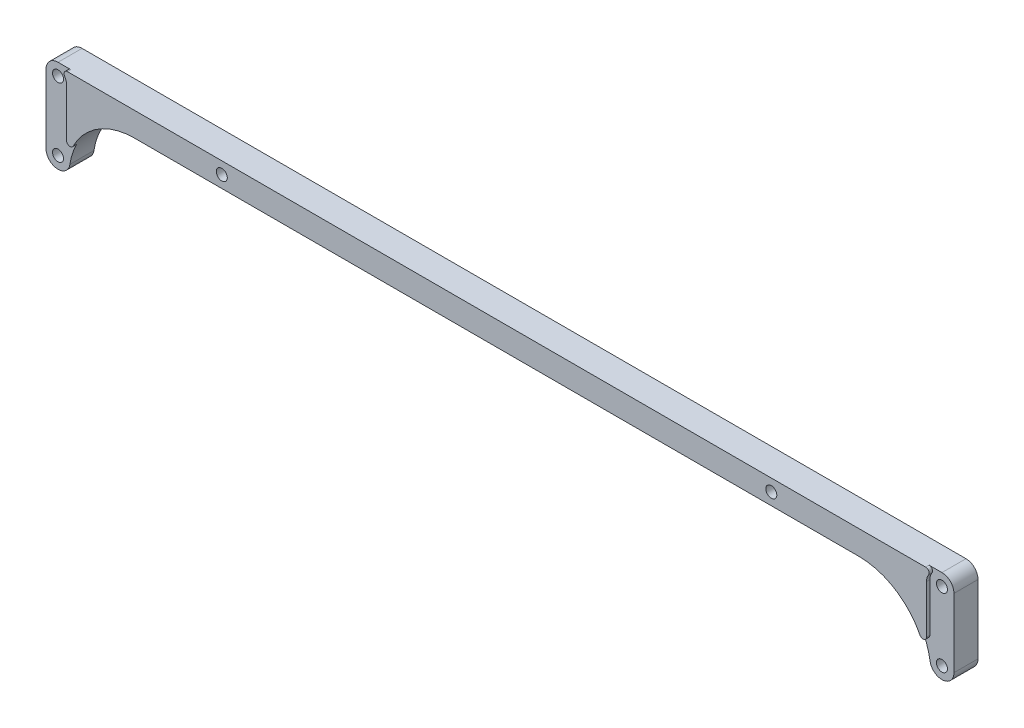
ISO-10303-21;
HEADER;
FILE_DESCRIPTION(('STEP AP214'),'2;1');
FILE_NAME('part.step','',(''),(''),'','','');
FILE_SCHEMA(('AUTOMOTIVE_DESIGN { 1 0 10303 214 1 1 1 1 }'));
ENDSEC;
DATA;
#1=APPLICATION_CONTEXT('core data for automotive mechanical design processes');
#2=APPLICATION_PROTOCOL_DEFINITION('international standard','automotive_design',2000,#1);
#3=PRODUCT_CONTEXT('',#1,'mechanical');
#4=PRODUCT('Part','Part','',(#3));
#5=PRODUCT_RELATED_PRODUCT_CATEGORY('part','',(#4));
#6=PRODUCT_DEFINITION_FORMATION('','',#4);
#7=PRODUCT_DEFINITION_CONTEXT('part definition',#1,'design');
#8=PRODUCT_DEFINITION('design','',#6,#7);
#9=PRODUCT_DEFINITION_SHAPE('','',#8);
#10=(LENGTH_UNIT() NAMED_UNIT(*) SI_UNIT(.MILLI.,.METRE.));
#11=(NAMED_UNIT(*) PLANE_ANGLE_UNIT() SI_UNIT($,.RADIAN.));
#12=(NAMED_UNIT(*) SI_UNIT($,.STERADIAN.) SOLID_ANGLE_UNIT());
#13=UNCERTAINTY_MEASURE_WITH_UNIT(LENGTH_MEASURE(1.E-05),#10,'distance_accuracy_value','');
#14=(GEOMETRIC_REPRESENTATION_CONTEXT(3) GLOBAL_UNCERTAINTY_ASSIGNED_CONTEXT((#13)) GLOBAL_UNIT_ASSIGNED_CONTEXT((#10,
#11,#12)) REPRESENTATION_CONTEXT('',''));
#15=CARTESIAN_POINT('',(0.,0.,0.));
#16=DIRECTION('',(0.,0.,1.));
#17=DIRECTION('',(1.,0.,0.));
#18=AXIS2_PLACEMENT_3D('',#15,#16,#17);
#19=CARTESIAN_POINT('',(-128.683849371952,-20.,-8.));
#20=DIRECTION('',(0.,0.,1.));
#21=DIRECTION('',(1.,0.,0.));
#22=AXIS2_PLACEMENT_3D('',#19,#20,#21);
#23=PLANE('',#22);
#24=CARTESIAN_POINT('',(-128.683849371952,-20.,-8.));
#25=DIRECTION('',(0.,0.,-1.));
#26=DIRECTION('',(-1.,0.,0.));
#27=AXIS2_PLACEMENT_3D('',#24,#25,#26);
#28=CIRCLE('',#27,1.59999999999999);
#29=CARTESIAN_POINT('',(-130.283849371952,-20.,-8.));
#30=VERTEX_POINT('',#29);
#31=EDGE_CURVE('E479',#30,#30,#28,.T.);
#32=ORIENTED_EDGE('',*,*,#31,.F.);
#33=EDGE_LOOP('',(#32));
#34=FACE_BOUND('',#33,.T.);
#35=CARTESIAN_POINT('',(-128.683849371952,0.,-8.));
#36=DIRECTION('',(0.,0.,-1.));
#37=DIRECTION('',(-1.,0.,0.));
#38=AXIS2_PLACEMENT_3D('',#35,#36,#37);
#39=CIRCLE('',#38,1.59999999999999);
#40=CARTESIAN_POINT('',(-130.283849371952,0.,-8.));
#41=VERTEX_POINT('',#40);
#42=EDGE_CURVE('E481',#41,#41,#39,.T.);
#43=ORIENTED_EDGE('',*,*,#42,.F.);
#44=EDGE_LOOP('',(#43));
#45=FACE_BOUND('',#44,.T.);
#46=CARTESIAN_POINT('',(-80.,0.,-8.));
#47=DIRECTION('',(0.,0.,-1.));
#48=DIRECTION('',(-1.,0.,0.));
#49=AXIS2_PLACEMENT_3D('',#46,#47,#48);
#50=CIRCLE('',#49,1.59999999999999);
#51=CARTESIAN_POINT('',(-81.6,0.,-8.));
#52=VERTEX_POINT('',#51);
#53=EDGE_CURVE('E489',#52,#52,#50,.T.);
#54=ORIENTED_EDGE('',*,*,#53,.F.);
#55=EDGE_LOOP('',(#54));
#56=FACE_BOUND('',#55,.T.);
#57=CARTESIAN_POINT('',(128.683849371952,-20.,-8.));
#58=DIRECTION('',(0.,0.,-1.));
#59=DIRECTION('',(-1.,0.,0.));
#60=AXIS2_PLACEMENT_3D('',#57,#58,#59);
#61=CIRCLE('',#60,1.59999999999999);
#62=CARTESIAN_POINT('',(127.083849371952,-20.,-8.));
#63=VERTEX_POINT('',#62);
#64=EDGE_CURVE('E495',#63,#63,#61,.T.);
#65=ORIENTED_EDGE('',*,*,#64,.F.);
#66=EDGE_LOOP('',(#65));
#67=FACE_BOUND('',#66,.T.);
#68=CARTESIAN_POINT('',(128.683849371952,0.,-8.));
#69=DIRECTION('',(0.,0.,-1.));
#70=DIRECTION('',(-1.,0.,0.));
#71=AXIS2_PLACEMENT_3D('',#68,#69,#70);
#72=CIRCLE('',#71,1.59999999999999);
#73=CARTESIAN_POINT('',(127.083849371952,0.,-8.));
#74=VERTEX_POINT('',#73);
#75=EDGE_CURVE('E501',#74,#74,#72,.T.);
#76=ORIENTED_EDGE('',*,*,#75,.F.);
#77=EDGE_LOOP('',(#76));
#78=FACE_BOUND('',#77,.T.);
#79=DIRECTION('',(0.,-1.,0.));
#80=VECTOR('',#79,1.);
#81=CARTESIAN_POINT('',(-132.183849371952,0.,-8.));
#82=LINE('',#81,#80);
#83=CARTESIAN_POINT('',(-132.183849371952,0.,-8.));
#84=VERTEX_POINT('',#83);
#85=CARTESIAN_POINT('',(-132.183849371952,-20.,-8.));
#86=VERTEX_POINT('',#85);
#87=EDGE_CURVE('E234',#84,#86,#82,.T.);
#88=ORIENTED_EDGE('',*,*,#87,.F.);
#89=CARTESIAN_POINT('',(-128.683849371952,0.,-8.));
#90=DIRECTION('',(0.,0.,1.));
#91=DIRECTION('',(1.,0.,0.));
#92=AXIS2_PLACEMENT_3D('',#89,#90,#91);
#93=CIRCLE('',#92,3.5);
#94=CARTESIAN_POINT('',(-128.683849371952,3.49999999999997,-8.));
#95=VERTEX_POINT('',#94);
#96=EDGE_CURVE('E257',#95,#84,#93,.T.);
#97=ORIENTED_EDGE('',*,*,#96,.F.);
#98=DIRECTION('',(1.,0.,0.));
#99=VECTOR('',#98,1.);
#100=CARTESIAN_POINT('',(-128.683849371952,3.49999999999997,-8.));
#101=LINE('',#100,#99);
#102=CARTESIAN_POINT('',(128.683849371952,3.50000000000001,-8.));
#103=VERTEX_POINT('',#102);
#104=EDGE_CURVE('E255',#95,#103,#101,.T.);
#105=ORIENTED_EDGE('',*,*,#104,.T.);
#106=CARTESIAN_POINT('',(128.683849371952,0.,-8.));
#107=DIRECTION('',(0.,0.,-1.));
#108=DIRECTION('',(-1.,0.,0.));
#109=AXIS2_PLACEMENT_3D('',#106,#107,#108);
#110=CIRCLE('',#109,3.5);
#111=CARTESIAN_POINT('',(132.183849371952,0.,-8.));
#112=VERTEX_POINT('',#111);
#113=EDGE_CURVE('E253',#103,#112,#110,.T.);
#114=ORIENTED_EDGE('',*,*,#113,.T.);
#115=DIRECTION('',(0.,-1.,0.));
#116=VECTOR('',#115,1.);
#117=CARTESIAN_POINT('',(132.183849371952,0.,-8.));
#118=LINE('',#117,#116);
#119=CARTESIAN_POINT('',(132.183849371952,-20.,-8.));
#120=VERTEX_POINT('',#119);
#121=EDGE_CURVE('E251',#112,#120,#118,.T.);
#122=ORIENTED_EDGE('',*,*,#121,.T.);
#123=CARTESIAN_POINT('',(128.683849371952,-20.,-8.));
#124=DIRECTION('',(0.,0.,-1.));
#125=DIRECTION('',(-1.,0.,0.));
#126=AXIS2_PLACEMENT_3D('',#123,#124,#125);
#127=CIRCLE('',#126,3.50000000000001);
#128=CARTESIAN_POINT('',(125.22288553066,-20.5212765957447,-8.));
#129=VERTEX_POINT('',#128);
#130=EDGE_CURVE('E249',#120,#129,#127,.T.);
#131=ORIENTED_EDGE('',*,*,#130,.T.);
#132=CARTESIAN_POINT('',(105.445949294707,-23.5,-8.));
#133=DIRECTION('',(0.,0.,-1.));
#134=DIRECTION('',(-1.,0.,0.));
#135=AXIS2_PLACEMENT_3D('',#132,#133,#134);
#136=CIRCLE('',#135,20.);
#137=CARTESIAN_POINT('',(105.445949294707,-3.50000000000002,-8.));
#138=VERTEX_POINT('',#137);
#139=EDGE_CURVE('E246',#138,#129,#136,.T.);
#140=ORIENTED_EDGE('',*,*,#139,.F.);
#141=DIRECTION('',(1.,0.,0.));
#142=VECTOR('',#141,1.);
#143=CARTESIAN_POINT('',(-105.445949294707,-3.50000000000004,-8.));
#144=LINE('',#143,#142);
#145=CARTESIAN_POINT('',(-105.445949294707,-3.50000000000005,-8.));
#146=VERTEX_POINT('',#145);
#147=EDGE_CURVE('E243',#146,#138,#144,.T.);
#148=ORIENTED_EDGE('',*,*,#147,.F.);
#149=CARTESIAN_POINT('',(-105.445949294707,-23.5,-8.));
#150=DIRECTION('',(0.,0.,1.));
#151=DIRECTION('',(1.,0.,0.));
#152=AXIS2_PLACEMENT_3D('',#149,#150,#151);
#153=CIRCLE('',#152,20.);
#154=CARTESIAN_POINT('',(-125.22288553066,-20.5212765957447,-8.));
#155=VERTEX_POINT('',#154);
#156=EDGE_CURVE('E241',#146,#155,#153,.T.);
#157=ORIENTED_EDGE('',*,*,#156,.T.);
#158=CARTESIAN_POINT('',(-128.683849371952,-20.,-8.));
#159=DIRECTION('',(0.,0.,1.));
#160=DIRECTION('',(1.,0.,0.));
#161=AXIS2_PLACEMENT_3D('',#158,#159,#160);
#162=CIRCLE('',#161,3.50000000000001);
#163=EDGE_CURVE('E237',#86,#155,#162,.T.);
#164=ORIENTED_EDGE('',*,*,#163,.F.);
#165=EDGE_LOOP('',(#88,#97,#105,#114,#122,#131,#140,#148,#157,#164));
#166=FACE_BOUND('',#165,.T.);
#167=CARTESIAN_POINT('',(80.,0.,-8.));
#168=DIRECTION('',(0.,0.,-1.));
#169=DIRECTION('',(-1.,0.,0.));
#170=AXIS2_PLACEMENT_3D('',#167,#168,#169);
#171=CIRCLE('',#170,1.59999999999999);
#172=CARTESIAN_POINT('',(78.4,0.,-8.));
#173=VERTEX_POINT('',#172);
#174=EDGE_CURVE('E506',#173,#173,#171,.T.);
#175=ORIENTED_EDGE('',*,*,#174,.F.);
#176=EDGE_LOOP('',(#175));
#177=FACE_BOUND('',#176,.T.);
#178=ADVANCED_FACE('F34',(#34,#45,#56,#67,#78,#166,#177),#23,.F.);
#179=CARTESIAN_POINT('',(128.683849371952,0.,-8.));
#180=DIRECTION('',(0.,0.,1.));
#181=DIRECTION('',(1.,0.,0.));
#182=AXIS2_PLACEMENT_3D('',#179,#180,#181);
#183=CYLINDRICAL_SURFACE('',#182,3.5);
#184=CARTESIAN_POINT('',(128.683849371952,0.,-1.));
#185=DIRECTION('',(0.,0.,1.));
#186=DIRECTION('',(1.,0.,0.));
#187=AXIS2_PLACEMENT_3D('',#184,#185,#186);
#188=CIRCLE('',#187,3.49999999999998);
#189=CARTESIAN_POINT('',(128.683849371952,3.5,-1.));
#190=VERTEX_POINT('',#189);
#191=CARTESIAN_POINT('',(132.183849371952,0.,-1.));
#192=VERTEX_POINT('',#191);
#193=EDGE_CURVE('E199',#190,#192,#188,.F.);
#194=ORIENTED_EDGE('',*,*,#193,.T.);
#195=DIRECTION('',(0.,0.,1.));
#196=VECTOR('',#195,1.);
#197=CARTESIAN_POINT('',(132.183849371952,0.,-8.));
#198=LINE('',#197,#196);
#199=EDGE_CURVE('E280',#112,#192,#198,.T.);
#200=ORIENTED_EDGE('',*,*,#199,.F.);
#201=ORIENTED_EDGE('',*,*,#113,.F.);
#202=DIRECTION('',(0.,0.,1.));
#203=VECTOR('',#202,1.);
#204=CARTESIAN_POINT('',(128.683849371952,3.50000000000001,-8.));
#205=LINE('',#204,#203);
#206=EDGE_CURVE('E277',#103,#190,#205,.T.);
#207=ORIENTED_EDGE('',*,*,#206,.T.);
#208=EDGE_LOOP('',(#194,#200,#201,#207));
#209=FACE_BOUND('',#208,.T.);
#210=ADVANCED_FACE('F374',(#209),#183,.T.);
#211=CARTESIAN_POINT('',(132.183849371952,0.,-8.));
#212=DIRECTION('',(-1.,0.,0.));
#213=DIRECTION('',(0.,-1.,0.));
#214=AXIS2_PLACEMENT_3D('',#211,#212,#213);
#215=PLANE('',#214);
#216=DIRECTION('',(0.,-1.,0.));
#217=VECTOR('',#216,1.);
#218=CARTESIAN_POINT('',(132.183849371952,1.83441941320406E-13,-1.));
#219=LINE('',#218,#217);
#220=CARTESIAN_POINT('',(132.183849371952,-20.,-1.));
#221=VERTEX_POINT('',#220);
#222=EDGE_CURVE('E194',#192,#221,#219,.T.);
#223=ORIENTED_EDGE('',*,*,#222,.T.);
#224=DIRECTION('',(0.,0.,1.));
#225=VECTOR('',#224,1.);
#226=CARTESIAN_POINT('',(132.183849371952,-20.,-8.));
#227=LINE('',#226,#225);
#228=EDGE_CURVE('E283',#120,#221,#227,.T.);
#229=ORIENTED_EDGE('',*,*,#228,.F.);
#230=ORIENTED_EDGE('',*,*,#121,.F.);
#231=ORIENTED_EDGE('',*,*,#199,.T.);
#232=EDGE_LOOP('',(#223,#229,#230,#231));
#233=FACE_BOUND('',#232,.T.);
#234=ADVANCED_FACE('F371',(#233),#215,.F.);
#235=CARTESIAN_POINT('',(128.683849371952,-20.,-8.));
#236=DIRECTION('',(0.,0.,1.));
#237=DIRECTION('',(1.,0.,0.));
#238=AXIS2_PLACEMENT_3D('',#235,#236,#237);
#239=CYLINDRICAL_SURFACE('',#238,3.50000000000001);
#240=CARTESIAN_POINT('',(128.683849371952,-20.,-1.));
#241=DIRECTION('',(0.,0.,1.));
#242=DIRECTION('',(1.,0.,0.));
#243=AXIS2_PLACEMENT_3D('',#240,#241,#242);
#244=CIRCLE('',#243,3.50000000000001);
#245=CARTESIAN_POINT('',(125.22288553066,-20.5212765957447,-1.));
#246=VERTEX_POINT('',#245);
#247=EDGE_CURVE('E208',#221,#246,#244,.F.);
#248=ORIENTED_EDGE('',*,*,#247,.T.);
#249=DIRECTION('',(0.,0.,1.));
#250=VECTOR('',#249,1.);
#251=CARTESIAN_POINT('',(125.22288553066,-20.5212765957447,-8.));
#252=LINE('',#251,#250);
#253=EDGE_CURVE('E286',#129,#246,#252,.T.);
#254=ORIENTED_EDGE('',*,*,#253,.F.);
#255=ORIENTED_EDGE('',*,*,#130,.F.);
#256=ORIENTED_EDGE('',*,*,#228,.T.);
#257=EDGE_LOOP('',(#248,#254,#255,#256));
#258=FACE_BOUND('',#257,.T.);
#259=ADVANCED_FACE('F361',(#258),#239,.T.);
#260=CARTESIAN_POINT('',(105.445949294707,-23.5,-8.));
#261=DIRECTION('',(0.,0.,1.));
#262=DIRECTION('',(1.,0.,0.));
#263=AXIS2_PLACEMENT_3D('',#260,#261,#262);
#264=CYLINDRICAL_SURFACE('',#263,20.);
#265=CARTESIAN_POINT('',(105.445949294707,-23.5,-1.));
#266=DIRECTION('',(0.,0.,1.));
#267=DIRECTION('',(1.,0.,0.));
#268=AXIS2_PLACEMENT_3D('',#265,#266,#267);
#269=CIRCLE('',#268,20.);
#270=CARTESIAN_POINT('',(123.291568415893,-14.470388813377,-1.));
#271=VERTEX_POINT('',#270);
#272=EDGE_CURVE('E183',#271,#246,#269,.F.);
#273=ORIENTED_EDGE('',*,*,#272,.F.);
#274=DIRECTION('',(0.,0.,1.));
#275=VECTOR('',#274,1.);
#276=CARTESIAN_POINT('',(123.291568415893,-14.470388813377,-8.));
#277=LINE('',#276,#275);
#278=CARTESIAN_POINT('',(123.291568415893,-14.470388813377,0.));
#279=VERTEX_POINT('',#278);
#280=EDGE_CURVE('E274',#271,#279,#277,.T.);
#281=ORIENTED_EDGE('',*,*,#280,.T.);
#282=CARTESIAN_POINT('',(105.445949294707,-23.5,0.));
#283=DIRECTION('',(0.,0.,-1.));
#284=DIRECTION('',(-1.,0.,0.));
#285=AXIS2_PLACEMENT_3D('',#282,#283,#284);
#286=CIRCLE('',#285,20.);
#287=CARTESIAN_POINT('',(105.445949294707,-3.50000000000002,0.));
#288=VERTEX_POINT('',#287);
#289=EDGE_CURVE('E266',#288,#279,#286,.T.);
#290=ORIENTED_EDGE('',*,*,#289,.F.);
#291=DIRECTION('',(0.,0.,1.));
#292=VECTOR('',#291,1.);
#293=CARTESIAN_POINT('',(105.445949294707,-3.50000000000002,-8.));
#294=LINE('',#293,#292);
#295=EDGE_CURVE('E289',#138,#288,#294,.T.);
#296=ORIENTED_EDGE('',*,*,#295,.F.);
#297=ORIENTED_EDGE('',*,*,#139,.T.);
#298=ORIENTED_EDGE('',*,*,#253,.T.);
#299=EDGE_LOOP('',(#273,#281,#290,#296,#297,#298));
#300=FACE_BOUND('',#299,.T.);
#301=ADVANCED_FACE('F354',(#300),#264,.F.);
#302=CARTESIAN_POINT('',(-128.683849371952,-20.,0.));
#303=DIRECTION('',(0.,0.,1.));
#304=DIRECTION('',(1.,0.,0.));
#305=AXIS2_PLACEMENT_3D('',#302,#303,#304);
#306=PLANE('',#305);
#307=CARTESIAN_POINT('',(-80.,0.,0.));
#308=DIRECTION('',(0.,0.,-1.));
#309=DIRECTION('',(-1.,0.,0.));
#310=AXIS2_PLACEMENT_3D('',#307,#308,#309);
#311=CIRCLE('',#310,1.6);
#312=CARTESIAN_POINT('',(-81.6,0.,0.));
#313=VERTEX_POINT('',#312);
#314=EDGE_CURVE('E492',#313,#313,#311,.T.);
#315=ORIENTED_EDGE('',*,*,#314,.T.);
#316=EDGE_LOOP('',(#315));
#317=FACE_BOUND('',#316,.T.);
#318=CARTESIAN_POINT('',(80.,0.,0.));
#319=DIRECTION('',(0.,0.,-1.));
#320=DIRECTION('',(-1.,0.,0.));
#321=AXIS2_PLACEMENT_3D('',#318,#319,#320);
#322=CIRCLE('',#321,1.6);
#323=CARTESIAN_POINT('',(78.4,0.,0.));
#324=VERTEX_POINT('',#323);
#325=EDGE_CURVE('E204',#324,#324,#322,.T.);
#326=ORIENTED_EDGE('',*,*,#325,.T.);
#327=EDGE_LOOP('',(#326));
#328=FACE_BOUND('',#327,.T.);
#329=ORIENTED_EDGE('',*,*,#289,.T.);
#330=CARTESIAN_POINT('',(124.183849371952,-14.0189082540458,0.));
#331=DIRECTION('',(0.,0.,1.));
#332=DIRECTION('',(1.,0.,0.));
#333=AXIS2_PLACEMENT_3D('',#330,#331,#332);
#334=CIRCLE('',#333,1.);
#335=CARTESIAN_POINT('',(125.183849371952,-14.0189082540458,0.));
#336=VERTEX_POINT('',#335);
#337=EDGE_CURVE('E306',#279,#336,#334,.T.);
#338=ORIENTED_EDGE('',*,*,#337,.T.);
#339=DIRECTION('',(0.,1.,0.));
#340=VECTOR('',#339,1.);
#341=CARTESIAN_POINT('',(125.183849371952,0.,0.));
#342=LINE('',#341,#340);
#343=CARTESIAN_POINT('',(125.183849371952,0.,0.));
#344=VERTEX_POINT('',#343);
#345=EDGE_CURVE('E202',#336,#344,#342,.T.);
#346=ORIENTED_EDGE('',*,*,#345,.T.);
#347=CARTESIAN_POINT('',(128.683849371952,0.,0.));
#348=DIRECTION('',(0.,0.,1.));
#349=DIRECTION('',(1.,0.,0.));
#350=AXIS2_PLACEMENT_3D('',#347,#348,#349);
#351=CIRCLE('',#350,3.49999999999998);
#352=CARTESIAN_POINT('',(125.773671404461,1.94444444444445,0.));
#353=VERTEX_POINT('',#352);
#354=EDGE_CURVE('E192',#344,#353,#351,.F.);
#355=ORIENTED_EDGE('',*,*,#354,.T.);
#356=CARTESIAN_POINT('',(124.942191985178,2.5,0.));
#357=DIRECTION('',(0.,0.,1.));
#358=DIRECTION('',(1.,0.,0.));
#359=AXIS2_PLACEMENT_3D('',#356,#357,#358);
#360=CIRCLE('',#359,1.);
#361=CARTESIAN_POINT('',(124.942191985178,3.5,0.));
#362=VERTEX_POINT('',#361);
#363=EDGE_CURVE('E304',#353,#362,#360,.T.);
#364=ORIENTED_EDGE('',*,*,#363,.T.);
#365=DIRECTION('',(1.,0.,0.));
#366=VECTOR('',#365,1.);
#367=CARTESIAN_POINT('',(-128.683849371952,3.49999999999997,0.));
#368=LINE('',#367,#366);
#369=CARTESIAN_POINT('',(-124.942191985178,3.49999999999997,0.));
#370=VERTEX_POINT('',#369);
#371=EDGE_CURVE('E238',#370,#362,#368,.T.);
#372=ORIENTED_EDGE('',*,*,#371,.F.);
#373=CARTESIAN_POINT('',(-124.942191985178,2.49999999999997,0.));
#374=DIRECTION('',(0.,0.,1.));
#375=DIRECTION('',(1.,0.,0.));
#376=AXIS2_PLACEMENT_3D('',#373,#374,#375);
#377=CIRCLE('',#376,1.);
#378=CARTESIAN_POINT('',(-125.773671404461,1.94444444444442,0.));
#379=VERTEX_POINT('',#378);
#380=EDGE_CURVE('E300',#370,#379,#377,.T.);
#381=ORIENTED_EDGE('',*,*,#380,.T.);
#382=CARTESIAN_POINT('',(-128.683849371952,0.,0.));
#383=DIRECTION('',(0.,0.,1.));
#384=DIRECTION('',(1.,0.,0.));
#385=AXIS2_PLACEMENT_3D('',#382,#383,#384);
#386=CIRCLE('',#385,3.49999999999998);
#387=CARTESIAN_POINT('',(-125.183849371952,0.,0.));
#388=VERTEX_POINT('',#387);
#389=EDGE_CURVE('E218',#388,#379,#386,.T.);
#390=ORIENTED_EDGE('',*,*,#389,.F.);
#391=DIRECTION('',(0.,1.,0.));
#392=VECTOR('',#391,1.);
#393=CARTESIAN_POINT('',(-125.183849371952,0.,0.));
#394=LINE('',#393,#392);
#395=CARTESIAN_POINT('',(-125.183849371952,-14.0189082540458,0.));
#396=VERTEX_POINT('',#395);
#397=EDGE_CURVE('E193',#396,#388,#394,.T.);
#398=ORIENTED_EDGE('',*,*,#397,.F.);
#399=CARTESIAN_POINT('',(-124.183849371952,-14.0189082540458,0.));
#400=DIRECTION('',(0.,0.,1.));
#401=DIRECTION('',(1.,0.,0.));
#402=AXIS2_PLACEMENT_3D('',#399,#400,#401);
#403=CIRCLE('',#402,1.);
#404=CARTESIAN_POINT('',(-123.291568415893,-14.470388813377,0.));
#405=VERTEX_POINT('',#404);
#406=EDGE_CURVE('E302',#396,#405,#403,.T.);
#407=ORIENTED_EDGE('',*,*,#406,.T.);
#408=CARTESIAN_POINT('',(-105.445949294707,-23.5,0.));
#409=DIRECTION('',(0.,0.,1.));
#410=DIRECTION('',(1.,0.,0.));
#411=AXIS2_PLACEMENT_3D('',#408,#409,#410);
#412=CIRCLE('',#411,20.);
#413=CARTESIAN_POINT('',(-105.445949294707,-3.50000000000005,0.));
#414=VERTEX_POINT('',#413);
#415=EDGE_CURVE('E233',#414,#405,#412,.T.);
#416=ORIENTED_EDGE('',*,*,#415,.F.);
#417=DIRECTION('',(1.,0.,0.));
#418=VECTOR('',#417,1.);
#419=CARTESIAN_POINT('',(-105.445949294707,-3.50000000000004,0.));
#420=LINE('',#419,#418);
#421=EDGE_CURVE('E263',#414,#288,#420,.T.);
#422=ORIENTED_EDGE('',*,*,#421,.T.);
#423=EDGE_LOOP('',(#329,#338,#346,#355,#364,#372,#381,#390,#398,#407,#416,#422));
#424=FACE_BOUND('',#423,.T.);
#425=ADVANCED_FACE('F342',(#317,#328,#424),#306,.T.);
#426=CARTESIAN_POINT('',(-132.183849371952,0.,-8.));
#427=DIRECTION('',(-1.,0.,0.));
#428=DIRECTION('',(0.,-1.,0.));
#429=AXIS2_PLACEMENT_3D('',#426,#427,#428);
#430=PLANE('',#429);
#431=DIRECTION('',(0.,0.,1.));
#432=VECTOR('',#431,1.);
#433=CARTESIAN_POINT('',(-132.183849371952,-20.,-8.));
#434=LINE('',#433,#432);
#435=CARTESIAN_POINT('',(-132.183849371952,-20.,-1.));
#436=VERTEX_POINT('',#435);
#437=EDGE_CURVE('E260',#86,#436,#434,.T.);
#438=ORIENTED_EDGE('',*,*,#437,.T.);
#439=DIRECTION('',(0.,-1.,0.));
#440=VECTOR('',#439,1.);
#441=CARTESIAN_POINT('',(-132.183849371952,1.83441941320406E-13,-1.));
#442=LINE('',#441,#440);
#443=CARTESIAN_POINT('',(-132.183849371952,0.,-1.));
#444=VERTEX_POINT('',#443);
#445=EDGE_CURVE('E221',#444,#436,#442,.T.);
#446=ORIENTED_EDGE('',*,*,#445,.F.);
#447=DIRECTION('',(0.,0.,1.));
#448=VECTOR('',#447,1.);
#449=CARTESIAN_POINT('',(-132.183849371952,0.,-8.));
#450=LINE('',#449,#448);
#451=EDGE_CURVE('E271',#84,#444,#450,.T.);
#452=ORIENTED_EDGE('',*,*,#451,.F.);
#453=ORIENTED_EDGE('',*,*,#87,.T.);
#454=EDGE_LOOP('',(#438,#446,#452,#453));
#455=FACE_BOUND('',#454,.T.);
#456=ADVANCED_FACE('F395',(#455),#430,.T.);
#457=CARTESIAN_POINT('',(-128.683849371952,0.,-8.));
#458=DIRECTION('',(0.,0.,1.));
#459=DIRECTION('',(1.,0.,0.));
#460=AXIS2_PLACEMENT_3D('',#457,#458,#459);
#461=CYLINDRICAL_SURFACE('',#460,3.5);
#462=ORIENTED_EDGE('',*,*,#451,.T.);
#463=CARTESIAN_POINT('',(-128.683849371952,0.,-1.));
#464=DIRECTION('',(0.,0.,1.));
#465=DIRECTION('',(1.,0.,0.));
#466=AXIS2_PLACEMENT_3D('',#463,#464,#465);
#467=CIRCLE('',#466,3.49999999999998);
#468=CARTESIAN_POINT('',(-128.683849371952,3.49999999999997,-1.));
#469=VERTEX_POINT('',#468);
#470=EDGE_CURVE('E217',#469,#444,#467,.T.);
#471=ORIENTED_EDGE('',*,*,#470,.F.);
#472=DIRECTION('',(0.,0.,1.));
#473=VECTOR('',#472,1.);
#474=CARTESIAN_POINT('',(-128.683849371952,3.49999999999997,-8.));
#475=LINE('',#474,#473);
#476=EDGE_CURVE('E275',#95,#469,#475,.T.);
#477=ORIENTED_EDGE('',*,*,#476,.F.);
#478=ORIENTED_EDGE('',*,*,#96,.T.);
#479=EDGE_LOOP('',(#462,#471,#477,#478));
#480=FACE_BOUND('',#479,.T.);
#481=ADVANCED_FACE('F391',(#480),#461,.T.);
#482=CARTESIAN_POINT('',(-128.683849371952,-20.,-8.));
#483=DIRECTION('',(0.,0.,1.));
#484=DIRECTION('',(1.,0.,0.));
#485=AXIS2_PLACEMENT_3D('',#482,#483,#484);
#486=CYLINDRICAL_SURFACE('',#485,3.50000000000001);
#487=DIRECTION('',(0.,0.,1.));
#488=VECTOR('',#487,1.);
#489=CARTESIAN_POINT('',(-125.22288553066,-20.5212765957447,-8.));
#490=LINE('',#489,#488);
#491=CARTESIAN_POINT('',(-125.22288553066,-20.5212765957447,-1.));
#492=VERTEX_POINT('',#491);
#493=EDGE_CURVE('E293',#155,#492,#490,.T.);
#494=ORIENTED_EDGE('',*,*,#493,.T.);
#495=CARTESIAN_POINT('',(-128.683849371952,-20.,-1.));
#496=DIRECTION('',(0.,0.,1.));
#497=DIRECTION('',(1.,0.,0.));
#498=AXIS2_PLACEMENT_3D('',#495,#496,#497);
#499=CIRCLE('',#498,3.50000000000001);
#500=EDGE_CURVE('E223',#436,#492,#499,.T.);
#501=ORIENTED_EDGE('',*,*,#500,.F.);
#502=ORIENTED_EDGE('',*,*,#437,.F.);
#503=ORIENTED_EDGE('',*,*,#163,.T.);
#504=EDGE_LOOP('',(#494,#501,#502,#503));
#505=FACE_BOUND('',#504,.T.);
#506=ADVANCED_FACE('F398',(#505),#486,.T.);
#507=CARTESIAN_POINT('',(-128.683849371952,3.49999999999997,-8.));
#508=DIRECTION('',(0.,-1.,0.));
#509=DIRECTION('',(1.,0.,0.));
#510=AXIS2_PLACEMENT_3D('',#507,#508,#509);
#511=PLANE('',#510);
#512=ORIENTED_EDGE('',*,*,#371,.T.);
#513=DIRECTION('',(0.,0.,-1.));
#514=VECTOR('',#513,1.);
#515=CARTESIAN_POINT('',(124.942191985178,3.5,-1.));
#516=LINE('',#515,#514);
#517=CARTESIAN_POINT('',(124.942191985178,3.5,-1.));
#518=VERTEX_POINT('',#517);
#519=EDGE_CURVE('E315',#362,#518,#516,.T.);
#520=ORIENTED_EDGE('',*,*,#519,.T.);
#521=DIRECTION('',(1.,0.,0.));
#522=VECTOR('',#521,1.);
#523=CARTESIAN_POINT('',(0.,3.49999999999999,-1.));
#524=LINE('',#523,#522);
#525=EDGE_CURVE('E313',#518,#190,#524,.T.);
#526=ORIENTED_EDGE('',*,*,#525,.T.);
#527=ORIENTED_EDGE('',*,*,#206,.F.);
#528=ORIENTED_EDGE('',*,*,#104,.F.);
#529=ORIENTED_EDGE('',*,*,#476,.T.);
#530=DIRECTION('',(1.,0.,0.));
#531=VECTOR('',#530,1.);
#532=CARTESIAN_POINT('',(0.,3.49999999999999,-1.));
#533=LINE('',#532,#531);
#534=CARTESIAN_POINT('',(-124.942191985178,3.49999999999997,-1.));
#535=VERTEX_POINT('',#534);
#536=EDGE_CURVE('E48',#469,#535,#533,.T.);
#537=ORIENTED_EDGE('',*,*,#536,.T.);
#538=DIRECTION('',(0.,0.,1.));
#539=VECTOR('',#538,1.);
#540=CARTESIAN_POINT('',(-124.942191985178,3.49999999999997,-8.));
#541=LINE('',#540,#539);
#542=EDGE_CURVE('E310',#535,#370,#541,.T.);
#543=ORIENTED_EDGE('',*,*,#542,.T.);
#544=EDGE_LOOP('',(#512,#520,#526,#527,#528,#529,#537,#543));
#545=FACE_BOUND('',#544,.T.);
#546=ADVANCED_FACE('F378',(#545),#511,.F.);
#547=CARTESIAN_POINT('',(-105.445949294707,-3.50000000000004,-8.));
#548=DIRECTION('',(0.,-1.,0.));
#549=DIRECTION('',(1.,0.,0.));
#550=AXIS2_PLACEMENT_3D('',#547,#548,#549);
#551=PLANE('',#550);
#552=ORIENTED_EDGE('',*,*,#421,.F.);
#553=DIRECTION('',(0.,0.,1.));
#554=VECTOR('',#553,1.);
#555=CARTESIAN_POINT('',(-105.445949294707,-3.50000000000005,-8.));
#556=LINE('',#555,#554);
#557=EDGE_CURVE('E291',#146,#414,#556,.T.);
#558=ORIENTED_EDGE('',*,*,#557,.F.);
#559=ORIENTED_EDGE('',*,*,#147,.T.);
#560=ORIENTED_EDGE('',*,*,#295,.T.);
#561=EDGE_LOOP('',(#552,#558,#559,#560));
#562=FACE_BOUND('',#561,.T.);
#563=ADVANCED_FACE('F351',(#562),#551,.T.);
#564=CARTESIAN_POINT('',(-105.445949294707,-23.5,-8.));
#565=DIRECTION('',(0.,0.,1.));
#566=DIRECTION('',(1.,0.,0.));
#567=AXIS2_PLACEMENT_3D('',#564,#565,#566);
#568=CYLINDRICAL_SURFACE('',#567,20.);
#569=ORIENTED_EDGE('',*,*,#415,.T.);
#570=DIRECTION('',(0.,0.,1.));
#571=VECTOR('',#570,1.);
#572=CARTESIAN_POINT('',(-123.291568415893,-14.470388813377,-8.));
#573=LINE('',#572,#571);
#574=CARTESIAN_POINT('',(-123.291568415893,-14.470388813377,-1.));
#575=VERTEX_POINT('',#574);
#576=EDGE_CURVE('E323',#405,#575,#573,.F.);
#577=ORIENTED_EDGE('',*,*,#576,.T.);
#578=CARTESIAN_POINT('',(-105.445949294707,-23.5,-1.));
#579=DIRECTION('',(0.,0.,1.));
#580=DIRECTION('',(1.,0.,0.));
#581=AXIS2_PLACEMENT_3D('',#578,#579,#580);
#582=CIRCLE('',#581,20.);
#583=EDGE_CURVE('E225',#575,#492,#582,.T.);
#584=ORIENTED_EDGE('',*,*,#583,.T.);
#585=ORIENTED_EDGE('',*,*,#493,.F.);
#586=ORIENTED_EDGE('',*,*,#156,.F.);
#587=ORIENTED_EDGE('',*,*,#557,.T.);
#588=EDGE_LOOP('',(#569,#577,#584,#585,#586,#587));
#589=FACE_BOUND('',#588,.T.);
#590=ADVANCED_FACE('F346',(#589),#568,.F.);
#591=CARTESIAN_POINT('',(-128.683849371952,0.,-1.));
#592=DIRECTION('',(0.,0.,1.));
#593=DIRECTION('',(1.,0.,0.));
#594=AXIS2_PLACEMENT_3D('',#591,#592,#593);
#595=CYLINDRICAL_SURFACE('',#594,3.49999999999998);
#596=ORIENTED_EDGE('',*,*,#389,.T.);
#597=DIRECTION('',(0.,0.,1.));
#598=VECTOR('',#597,1.);
#599=CARTESIAN_POINT('',(-125.773671404461,1.94444444444442,-1.));
#600=LINE('',#599,#598);
#601=CARTESIAN_POINT('',(-125.773671404461,1.94444444444442,-1.));
#602=VERTEX_POINT('',#601);
#603=EDGE_CURVE('E56',#379,#602,#600,.F.);
#604=ORIENTED_EDGE('',*,*,#603,.T.);
#605=CARTESIAN_POINT('',(-125.183849371952,0.,-1.));
#606=VERTEX_POINT('',#605);
#607=EDGE_CURVE('E219',#606,#602,#467,.T.);
#608=ORIENTED_EDGE('',*,*,#607,.F.);
#609=DIRECTION('',(0.,0.,1.));
#610=VECTOR('',#609,1.);
#611=CARTESIAN_POINT('',(-125.183849371952,0.,-1.));
#612=LINE('',#611,#610);
#613=EDGE_CURVE('E228',#606,#388,#612,.T.);
#614=ORIENTED_EDGE('',*,*,#613,.T.);
#615=EDGE_LOOP('',(#596,#604,#608,#614));
#616=FACE_BOUND('',#615,.T.);
#617=ADVANCED_FACE('F387',(#616),#595,.F.);
#618=CARTESIAN_POINT('',(-125.183849371952,0.,-1.));
#619=DIRECTION('',(1.,0.,0.));
#620=DIRECTION('',(0.,0.,-1.));
#621=AXIS2_PLACEMENT_3D('',#618,#619,#620);
#622=PLANE('',#621);
#623=DIRECTION('',(0.,1.,0.));
#624=VECTOR('',#623,1.);
#625=CARTESIAN_POINT('',(-125.183849371952,0.,-1.));
#626=LINE('',#625,#624);
#627=CARTESIAN_POINT('',(-125.183849371952,-14.0189082540458,-1.));
#628=VERTEX_POINT('',#627);
#629=EDGE_CURVE('E215',#628,#606,#626,.T.);
#630=ORIENTED_EDGE('',*,*,#629,.F.);
#631=DIRECTION('',(0.,0.,1.));
#632=VECTOR('',#631,1.);
#633=CARTESIAN_POINT('',(-125.183849371952,-14.0189082540458,-1.));
#634=LINE('',#633,#632);
#635=EDGE_CURVE('E320',#628,#396,#634,.T.);
#636=ORIENTED_EDGE('',*,*,#635,.T.);
#637=ORIENTED_EDGE('',*,*,#397,.T.);
#638=ORIENTED_EDGE('',*,*,#613,.F.);
#639=EDGE_LOOP('',(#630,#636,#637,#638));
#640=FACE_BOUND('',#639,.T.);
#641=ADVANCED_FACE('F337',(#640),#622,.F.);
#642=CARTESIAN_POINT('',(0.,0.,-1.));
#643=DIRECTION('',(0.,0.,1.));
#644=DIRECTION('',(1.,0.,0.));
#645=AXIS2_PLACEMENT_3D('',#642,#643,#644);
#646=PLANE('',#645);
#647=CARTESIAN_POINT('',(-128.683849371952,-20.,-1.));
#648=DIRECTION('',(0.,0.,1.));
#649=DIRECTION('',(1.,0.,0.));
#650=AXIS2_PLACEMENT_3D('',#647,#648,#649);
#651=CIRCLE('',#650,1.59999999999999);
#652=CARTESIAN_POINT('',(-127.083849371952,-20.,-1.));
#653=VERTEX_POINT('',#652);
#654=EDGE_CURVE('E477',#653,#653,#651,.T.);
#655=ORIENTED_EDGE('',*,*,#654,.F.);
#656=EDGE_LOOP('',(#655));
#657=FACE_BOUND('',#656,.T.);
#658=CARTESIAN_POINT('',(-128.683849371952,0.,-1.));
#659=DIRECTION('',(0.,0.,1.));
#660=DIRECTION('',(1.,0.,0.));
#661=AXIS2_PLACEMENT_3D('',#658,#659,#660);
#662=CIRCLE('',#661,1.59999999999999);
#663=CARTESIAN_POINT('',(-127.083849371952,0.,-1.));
#664=VERTEX_POINT('',#663);
#665=EDGE_CURVE('E486',#664,#664,#662,.T.);
#666=ORIENTED_EDGE('',*,*,#665,.F.);
#667=EDGE_LOOP('',(#666));
#668=FACE_BOUND('',#667,.T.);
#669=ORIENTED_EDGE('',*,*,#583,.F.);
#670=CARTESIAN_POINT('',(-124.183849371952,-14.0189082540458,-1.));
#671=DIRECTION('',(0.,0.,1.));
#672=DIRECTION('',(1.,0.,0.));
#673=AXIS2_PLACEMENT_3D('',#670,#671,#672);
#674=CIRCLE('',#673,1.);
#675=EDGE_CURVE('E42',#575,#628,#674,.F.);
#676=ORIENTED_EDGE('',*,*,#675,.T.);
#677=ORIENTED_EDGE('',*,*,#629,.T.);
#678=ORIENTED_EDGE('',*,*,#607,.T.);
#679=CARTESIAN_POINT('',(-124.942191985178,2.49999999999997,-1.));
#680=DIRECTION('',(0.,0.,1.));
#681=DIRECTION('',(1.,0.,0.));
#682=AXIS2_PLACEMENT_3D('',#679,#680,#681);
#683=CIRCLE('',#682,1.);
#684=EDGE_CURVE('E11',#602,#535,#683,.F.);
#685=ORIENTED_EDGE('',*,*,#684,.T.);
#686=ORIENTED_EDGE('',*,*,#536,.F.);
#687=ORIENTED_EDGE('',*,*,#470,.T.);
#688=ORIENTED_EDGE('',*,*,#445,.T.);
#689=ORIENTED_EDGE('',*,*,#500,.T.);
#690=EDGE_LOOP('',(#669,#676,#677,#678,#685,#686,#687,#688,#689));
#691=FACE_BOUND('',#690,.T.);
#692=ADVANCED_FACE('F331',(#657,#668,#691),#646,.T.);
#693=CARTESIAN_POINT('',(128.683849371952,0.,-1.));
#694=DIRECTION('',(0.,0.,1.));
#695=DIRECTION('',(1.,0.,0.));
#696=AXIS2_PLACEMENT_3D('',#693,#694,#695);
#697=CYLINDRICAL_SURFACE('',#696,3.49999999999998);
#698=CARTESIAN_POINT('',(125.183849371952,0.,-1.));
#699=VERTEX_POINT('',#698);
#700=CARTESIAN_POINT('',(125.773671404461,1.94444444444445,-1.));
#701=VERTEX_POINT('',#700);
#702=EDGE_CURVE('E184',#699,#701,#188,.F.);
#703=ORIENTED_EDGE('',*,*,#702,.T.);
#704=DIRECTION('',(0.,0.,1.));
#705=VECTOR('',#704,1.);
#706=CARTESIAN_POINT('',(125.773671404461,1.94444444444445,-1.));
#707=LINE('',#706,#705);
#708=EDGE_CURVE('E318',#701,#353,#707,.T.);
#709=ORIENTED_EDGE('',*,*,#708,.T.);
#710=ORIENTED_EDGE('',*,*,#354,.F.);
#711=DIRECTION('',(0.,0.,1.));
#712=VECTOR('',#711,1.);
#713=CARTESIAN_POINT('',(125.183849371952,0.,-1.));
#714=LINE('',#713,#712);
#715=EDGE_CURVE('E176',#699,#344,#714,.T.);
#716=ORIENTED_EDGE('',*,*,#715,.F.);
#717=EDGE_LOOP('',(#703,#709,#710,#716));
#718=FACE_BOUND('',#717,.T.);
#719=ADVANCED_FACE('F189',(#718),#697,.F.);
#720=CARTESIAN_POINT('',(125.183849371952,0.,-1.));
#721=DIRECTION('',(1.,0.,0.));
#722=DIRECTION('',(0.,0.,-1.));
#723=AXIS2_PLACEMENT_3D('',#720,#721,#722);
#724=PLANE('',#723);
#725=ORIENTED_EDGE('',*,*,#345,.F.);
#726=DIRECTION('',(0.,0.,1.));
#727=VECTOR('',#726,1.);
#728=CARTESIAN_POINT('',(125.183849371952,-14.0189082540458,-1.));
#729=LINE('',#728,#727);
#730=CARTESIAN_POINT('',(125.183849371952,-14.0189082540458,-1.));
#731=VERTEX_POINT('',#730);
#732=EDGE_CURVE('E178',#336,#731,#729,.F.);
#733=ORIENTED_EDGE('',*,*,#732,.T.);
#734=DIRECTION('',(0.,1.,0.));
#735=VECTOR('',#734,1.);
#736=CARTESIAN_POINT('',(125.183849371952,0.,-1.));
#737=LINE('',#736,#735);
#738=EDGE_CURVE('E172',#731,#699,#737,.T.);
#739=ORIENTED_EDGE('',*,*,#738,.T.);
#740=ORIENTED_EDGE('',*,*,#715,.T.);
#741=EDGE_LOOP('',(#725,#733,#739,#740));
#742=FACE_BOUND('',#741,.T.);
#743=ADVANCED_FACE('F175',(#742),#724,.T.);
#744=CARTESIAN_POINT('',(0.,0.,-1.));
#745=DIRECTION('',(0.,0.,1.));
#746=DIRECTION('',(1.,0.,0.));
#747=AXIS2_PLACEMENT_3D('',#744,#745,#746);
#748=PLANE('',#747);
#749=CARTESIAN_POINT('',(128.683849371952,-20.,-1.));
#750=DIRECTION('',(0.,0.,1.));
#751=DIRECTION('',(1.,0.,0.));
#752=AXIS2_PLACEMENT_3D('',#749,#750,#751);
#753=CIRCLE('',#752,1.59999999999999);
#754=CARTESIAN_POINT('',(130.283849371952,-20.,-1.));
#755=VERTEX_POINT('',#754);
#756=EDGE_CURVE('E498',#755,#755,#753,.T.);
#757=ORIENTED_EDGE('',*,*,#756,.F.);
#758=EDGE_LOOP('',(#757));
#759=FACE_BOUND('',#758,.T.);
#760=CARTESIAN_POINT('',(128.683849371952,0.,-1.));
#761=DIRECTION('',(0.,0.,1.));
#762=DIRECTION('',(1.,0.,0.));
#763=AXIS2_PLACEMENT_3D('',#760,#761,#762);
#764=CIRCLE('',#763,1.59999999999999);
#765=CARTESIAN_POINT('',(130.283849371952,0.,-1.));
#766=VERTEX_POINT('',#765);
#767=EDGE_CURVE('E504',#766,#766,#764,.T.);
#768=ORIENTED_EDGE('',*,*,#767,.F.);
#769=EDGE_LOOP('',(#768));
#770=FACE_BOUND('',#769,.T.);
#771=ORIENTED_EDGE('',*,*,#702,.F.);
#772=ORIENTED_EDGE('',*,*,#738,.F.);
#773=CARTESIAN_POINT('',(124.183849371952,-14.0189082540458,-1.));
#774=DIRECTION('',(0.,0.,1.));
#775=DIRECTION('',(1.,0.,0.));
#776=AXIS2_PLACEMENT_3D('',#773,#774,#775);
#777=CIRCLE('',#776,1.);
#778=EDGE_CURVE('E327',#731,#271,#777,.F.);
#779=ORIENTED_EDGE('',*,*,#778,.T.);
#780=ORIENTED_EDGE('',*,*,#272,.T.);
#781=ORIENTED_EDGE('',*,*,#247,.F.);
#782=ORIENTED_EDGE('',*,*,#222,.F.);
#783=ORIENTED_EDGE('',*,*,#193,.F.);
#784=ORIENTED_EDGE('',*,*,#525,.F.);
#785=CARTESIAN_POINT('',(124.942191985178,2.5,-1.));
#786=DIRECTION('',(0.,0.,1.));
#787=DIRECTION('',(1.,0.,0.));
#788=AXIS2_PLACEMENT_3D('',#785,#786,#787);
#789=CIRCLE('',#788,1.);
#790=EDGE_CURVE('E198',#518,#701,#789,.F.);
#791=ORIENTED_EDGE('',*,*,#790,.T.);
#792=EDGE_LOOP('',(#771,#772,#779,#780,#781,#782,#783,#784,#791));
#793=FACE_BOUND('',#792,.T.);
#794=ADVANCED_FACE('F196',(#759,#770,#793),#748,.T.);
#795=CARTESIAN_POINT('',(124.183849371952,-14.0189082540458,-8.));
#796=DIRECTION('',(0.,0.,1.));
#797=DIRECTION('',(1.,0.,0.));
#798=AXIS2_PLACEMENT_3D('',#795,#796,#797);
#799=CYLINDRICAL_SURFACE('',#798,1.);
#800=ORIENTED_EDGE('',*,*,#778,.F.);
#801=ORIENTED_EDGE('',*,*,#732,.F.);
#802=ORIENTED_EDGE('',*,*,#337,.F.);
#803=ORIENTED_EDGE('',*,*,#280,.F.);
#804=EDGE_LOOP('',(#800,#801,#802,#803));
#805=FACE_BOUND('',#804,.T.);
#806=ADVANCED_FACE('F358',(#805),#799,.T.);
#807=CARTESIAN_POINT('',(124.942191985178,2.5,-1.));
#808=DIRECTION('',(0.,0.,1.));
#809=DIRECTION('',(1.,0.,0.));
#810=AXIS2_PLACEMENT_3D('',#807,#808,#809);
#811=CYLINDRICAL_SURFACE('',#810,1.);
#812=ORIENTED_EDGE('',*,*,#363,.F.);
#813=ORIENTED_EDGE('',*,*,#708,.F.);
#814=ORIENTED_EDGE('',*,*,#790,.F.);
#815=ORIENTED_EDGE('',*,*,#519,.F.);
#816=EDGE_LOOP('',(#812,#813,#814,#815));
#817=FACE_BOUND('',#816,.T.);
#818=ADVANCED_FACE('F384',(#817),#811,.T.);
#819=CARTESIAN_POINT('',(-124.183849371952,-14.0189082540458,-8.));
#820=DIRECTION('',(0.,0.,1.));
#821=DIRECTION('',(1.,0.,0.));
#822=AXIS2_PLACEMENT_3D('',#819,#820,#821);
#823=CYLINDRICAL_SURFACE('',#822,1.);
#824=ORIENTED_EDGE('',*,*,#675,.F.);
#825=ORIENTED_EDGE('',*,*,#576,.F.);
#826=ORIENTED_EDGE('',*,*,#406,.F.);
#827=ORIENTED_EDGE('',*,*,#635,.F.);
#828=EDGE_LOOP('',(#824,#825,#826,#827));
#829=FACE_BOUND('',#828,.T.);
#830=ADVANCED_FACE('F339',(#829),#823,.T.);
#831=CARTESIAN_POINT('',(-124.942191985178,2.49999999999997,-1.));
#832=DIRECTION('',(0.,0.,1.));
#833=DIRECTION('',(1.,0.,0.));
#834=AXIS2_PLACEMENT_3D('',#831,#832,#833);
#835=CYLINDRICAL_SURFACE('',#834,1.);
#836=ORIENTED_EDGE('',*,*,#684,.F.);
#837=ORIENTED_EDGE('',*,*,#603,.F.);
#838=ORIENTED_EDGE('',*,*,#380,.F.);
#839=ORIENTED_EDGE('',*,*,#542,.F.);
#840=EDGE_LOOP('',(#836,#837,#838,#839));
#841=FACE_BOUND('',#840,.T.);
#842=ADVANCED_FACE('F36',(#841),#835,.T.);
#843=CARTESIAN_POINT('',(80.,0.,-8.));
#844=DIRECTION('',(0.,0.,-1.));
#845=DIRECTION('',(-1.,0.,0.));
#846=AXIS2_PLACEMENT_3D('',#843,#844,#845);
#847=CYLINDRICAL_SURFACE('',#846,1.6);
#848=ORIENTED_EDGE('',*,*,#325,.F.);
#849=EDGE_LOOP('',(#848));
#850=FACE_BOUND('',#849,.T.);
#851=ORIENTED_EDGE('',*,*,#174,.T.);
#852=EDGE_LOOP('',(#851));
#853=FACE_BOUND('',#852,.T.);
#854=ADVANCED_FACE('F449',(#850,#853),#847,.F.);
#855=CARTESIAN_POINT('',(128.683849371952,0.,-8.));
#856=DIRECTION('',(0.,0.,-1.));
#857=DIRECTION('',(-1.,0.,0.));
#858=AXIS2_PLACEMENT_3D('',#855,#856,#857);
#859=CYLINDRICAL_SURFACE('',#858,1.59999999999999);
#860=ORIENTED_EDGE('',*,*,#767,.T.);
#861=EDGE_LOOP('',(#860));
#862=FACE_BOUND('',#861,.T.);
#863=ORIENTED_EDGE('',*,*,#75,.T.);
#864=EDGE_LOOP('',(#863));
#865=FACE_BOUND('',#864,.T.);
#866=ADVANCED_FACE('F452',(#862,#865),#859,.F.);
#867=CARTESIAN_POINT('',(128.683849371952,-20.,-8.));
#868=DIRECTION('',(0.,0.,-1.));
#869=DIRECTION('',(-1.,0.,0.));
#870=AXIS2_PLACEMENT_3D('',#867,#868,#869);
#871=CYLINDRICAL_SURFACE('',#870,1.59999999999999);
#872=ORIENTED_EDGE('',*,*,#756,.T.);
#873=EDGE_LOOP('',(#872));
#874=FACE_BOUND('',#873,.T.);
#875=ORIENTED_EDGE('',*,*,#64,.T.);
#876=EDGE_LOOP('',(#875));
#877=FACE_BOUND('',#876,.T.);
#878=ADVANCED_FACE('F456',(#874,#877),#871,.F.);
#879=CARTESIAN_POINT('',(-80.,0.,-8.));
#880=DIRECTION('',(0.,0.,-1.));
#881=DIRECTION('',(-1.,0.,0.));
#882=AXIS2_PLACEMENT_3D('',#879,#880,#881);
#883=CYLINDRICAL_SURFACE('',#882,1.6);
#884=ORIENTED_EDGE('',*,*,#314,.F.);
#885=EDGE_LOOP('',(#884));
#886=FACE_BOUND('',#885,.T.);
#887=ORIENTED_EDGE('',*,*,#53,.T.);
#888=EDGE_LOOP('',(#887));
#889=FACE_BOUND('',#888,.T.);
#890=ADVANCED_FACE('F460',(#886,#889),#883,.F.);
#891=CARTESIAN_POINT('',(-128.683849371952,0.,-8.));
#892=DIRECTION('',(0.,0.,-1.));
#893=DIRECTION('',(-1.,0.,0.));
#894=AXIS2_PLACEMENT_3D('',#891,#892,#893);
#895=CYLINDRICAL_SURFACE('',#894,1.59999999999999);
#896=ORIENTED_EDGE('',*,*,#665,.T.);
#897=EDGE_LOOP('',(#896));
#898=FACE_BOUND('',#897,.T.);
#899=ORIENTED_EDGE('',*,*,#42,.T.);
#900=EDGE_LOOP('',(#899));
#901=FACE_BOUND('',#900,.T.);
#902=ADVANCED_FACE('F464',(#898,#901),#895,.F.);
#903=CARTESIAN_POINT('',(-128.683849371952,-20.,-8.));
#904=DIRECTION('',(0.,0.,-1.));
#905=DIRECTION('',(-1.,0.,0.));
#906=AXIS2_PLACEMENT_3D('',#903,#904,#905);
#907=CYLINDRICAL_SURFACE('',#906,1.59999999999999);
#908=ORIENTED_EDGE('',*,*,#654,.T.);
#909=EDGE_LOOP('',(#908));
#910=FACE_BOUND('',#909,.T.);
#911=ORIENTED_EDGE('',*,*,#31,.T.);
#912=EDGE_LOOP('',(#911));
#913=FACE_BOUND('',#912,.T.);
#914=ADVANCED_FACE('F468',(#910,#913),#907,.F.);
#915=CLOSED_SHELL('',(#178,#210,#234,#259,#301,#425,#456,#481,#506,#546,#563,#590,#617,#641,
#692,#719,#743,#794,#806,#818,#830,#842,#854,#866,#878,#890,#902,#914));
#916=MANIFOLD_SOLID_BREP('B2',#915);
#917=ADVANCED_BREP_SHAPE_REPRESENTATION('',(#18,#916),#14);
#918=SHAPE_DEFINITION_REPRESENTATION(#9,#917);
ENDSEC;
END-ISO-10303-21;
